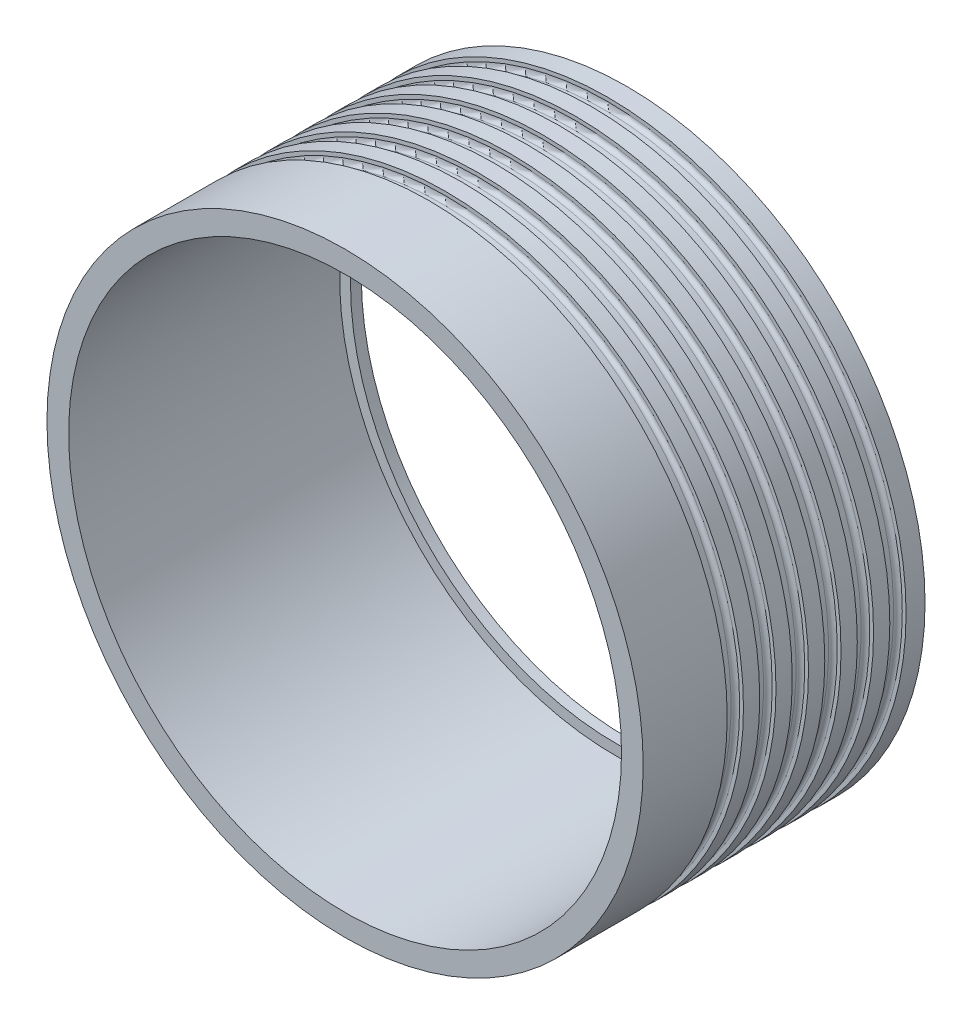
ISO-10303-21;
HEADER;
FILE_DESCRIPTION(('STEP AP214'),'2;1');
FILE_NAME('part.step','',(''),(''),'','','');
FILE_SCHEMA(('AUTOMOTIVE_DESIGN { 1 0 10303 214 1 1 1 1 }'));
ENDSEC;
DATA;
#1=APPLICATION_CONTEXT('core data for automotive mechanical design processes');
#2=APPLICATION_PROTOCOL_DEFINITION('international standard','automotive_design',2000,#1);
#3=PRODUCT_CONTEXT('',#1,'mechanical');
#4=PRODUCT('Part','Part','',(#3));
#5=PRODUCT_RELATED_PRODUCT_CATEGORY('part','',(#4));
#6=PRODUCT_DEFINITION_FORMATION('','',#4);
#7=PRODUCT_DEFINITION_CONTEXT('part definition',#1,'design');
#8=PRODUCT_DEFINITION('design','',#6,#7);
#9=PRODUCT_DEFINITION_SHAPE('','',#8);
#10=(LENGTH_UNIT() NAMED_UNIT(*) SI_UNIT(.MILLI.,.METRE.));
#11=(NAMED_UNIT(*) PLANE_ANGLE_UNIT() SI_UNIT($,.RADIAN.));
#12=(NAMED_UNIT(*) SI_UNIT($,.STERADIAN.) SOLID_ANGLE_UNIT());
#13=UNCERTAINTY_MEASURE_WITH_UNIT(LENGTH_MEASURE(1.E-05),#10,'distance_accuracy_value','');
#14=(GEOMETRIC_REPRESENTATION_CONTEXT(3) GLOBAL_UNCERTAINTY_ASSIGNED_CONTEXT((#13)) GLOBAL_UNIT_ASSIGNED_CONTEXT((#10,
#11,#12)) REPRESENTATION_CONTEXT('',''));
#15=CARTESIAN_POINT('',(0.,0.,0.));
#16=DIRECTION('',(0.,0.,1.));
#17=DIRECTION('',(1.,0.,0.));
#18=AXIS2_PLACEMENT_3D('',#15,#16,#17);
#19=CARTESIAN_POINT('',(0.,28.0540529829093,9.25000000000001));
#20=DIRECTION('',(0.,0.,1.));
#21=DIRECTION('',(1.,0.,0.));
#22=AXIS2_PLACEMENT_3D('',#19,#20,#21);
#23=PLANE('',#22);
#24=CARTESIAN_POINT('',(0.,0.,9.25000000000001));
#25=DIRECTION('',(0.,0.,-1.));
#26=DIRECTION('',(-1.,0.,0.));
#27=AXIS2_PLACEMENT_3D('',#24,#25,#26);
#28=CIRCLE('',#27,27.5);
#29=CARTESIAN_POINT('',(-27.5,0.,9.25000000000001));
#30=VERTEX_POINT('',#29);
#31=EDGE_CURVE('E113',#30,#30,#28,.F.);
#32=ORIENTED_EDGE('',*,*,#31,.F.);
#33=EDGE_LOOP('',(#32));
#34=FACE_BOUND('',#33,.T.);
#35=CARTESIAN_POINT('',(0.,0.,9.25000000000001));
#36=DIRECTION('',(0.,0.,-1.));
#37=DIRECTION('',(1.,0.,0.));
#38=AXIS2_PLACEMENT_3D('',#35,#36,#37);
#39=CIRCLE('',#38,27.15);
#40=CARTESIAN_POINT('',(-27.15,0.,9.25000000000001));
#41=VERTEX_POINT('',#40);
#42=CARTESIAN_POINT('',(27.15,0.,9.25000000000001));
#43=VERTEX_POINT('',#42);
#44=EDGE_CURVE('E109',#41,#43,#39,.F.);
#45=ORIENTED_EDGE('',*,*,#44,.T.);
#46=CARTESIAN_POINT('',(0.,0.,9.25000000000001));
#47=DIRECTION('',(0.,0.,-1.));
#48=DIRECTION('',(-1.,0.,0.));
#49=AXIS2_PLACEMENT_3D('',#46,#47,#48);
#50=CIRCLE('',#49,27.15);
#51=EDGE_CURVE('E106',#43,#41,#50,.F.);
#52=ORIENTED_EDGE('',*,*,#51,.T.);
#53=EDGE_LOOP('',(#45,#52));
#54=FACE_BOUND('',#53,.T.);
#55=ADVANCED_FACE('F17',(#34,#54),#23,.F.);
#56=CARTESIAN_POINT('',(0.,0.,26.));
#57=DIRECTION('',(0.,0.,-1.));
#58=DIRECTION('',(-1.,0.,0.));
#59=AXIS2_PLACEMENT_3D('',#56,#57,#58);
#60=CYLINDRICAL_SURFACE('',#59,27.5);
#61=ORIENTED_EDGE('',*,*,#31,.T.);
#62=EDGE_LOOP('',(#61));
#63=FACE_BOUND('',#62,.T.);
#64=CARTESIAN_POINT('',(0.,0.,10.75));
#65=DIRECTION('',(0.,0.,-1.));
#66=DIRECTION('',(-1.,0.,0.));
#67=AXIS2_PLACEMENT_3D('',#64,#65,#66);
#68=CIRCLE('',#67,27.5);
#69=CARTESIAN_POINT('',(-27.5,0.,10.75));
#70=VERTEX_POINT('',#69);
#71=EDGE_CURVE('E116',#70,#70,#68,.T.);
#72=ORIENTED_EDGE('',*,*,#71,.T.);
#73=EDGE_LOOP('',(#72));
#74=FACE_BOUND('',#73,.T.);
#75=ADVANCED_FACE('F142',(#63,#74),#60,.T.);
#76=CARTESIAN_POINT('',(0.,0.,8.85));
#77=DIRECTION('',(0.,0.,-1.));
#78=DIRECTION('',(-1.,0.,0.));
#79=AXIS2_PLACEMENT_3D('',#76,#77,#78);
#80=TOROIDAL_SURFACE('',#79,27.15,0.400000000000001);
#81=CARTESIAN_POINT('',(0.,0.,8.85));
#82=DIRECTION('',(0.,0.,-1.));
#83=DIRECTION('',(-1.,0.,0.));
#84=AXIS2_PLACEMENT_3D('',#81,#82,#83);
#85=CIRCLE('',#84,26.75);
#86=CARTESIAN_POINT('',(-26.75,0.,8.85));
#87=VERTEX_POINT('',#86);
#88=EDGE_CURVE('E149',#87,#87,#85,.T.);
#89=ORIENTED_EDGE('',*,*,#88,.F.);
#90=EDGE_LOOP('',(#89));
#91=FACE_BOUND('',#90,.T.);
#92=ORIENTED_EDGE('',*,*,#44,.F.);
#93=ORIENTED_EDGE('',*,*,#51,.F.);
#94=EDGE_LOOP('',(#92,#93));
#95=FACE_BOUND('',#94,.T.);
#96=ADVANCED_FACE('F110',(#91,#95),#80,.F.);
#97=CARTESIAN_POINT('',(0.,28.0540529829093,10.75));
#98=DIRECTION('',(0.,0.,-1.));
#99=DIRECTION('',(-1.,0.,0.));
#100=AXIS2_PLACEMENT_3D('',#97,#98,#99);
#101=PLANE('',#100);
#102=ORIENTED_EDGE('',*,*,#71,.F.);
#103=EDGE_LOOP('',(#102));
#104=FACE_BOUND('',#103,.T.);
#105=CARTESIAN_POINT('',(0.,0.,10.75));
#106=DIRECTION('',(0.,0.,1.));
#107=DIRECTION('',(-1.,0.,0.));
#108=AXIS2_PLACEMENT_3D('',#105,#106,#107);
#109=CIRCLE('',#108,27.15);
#110=CARTESIAN_POINT('',(27.15,0.,10.75));
#111=VERTEX_POINT('',#110);
#112=CARTESIAN_POINT('',(-27.15,0.,10.75));
#113=VERTEX_POINT('',#112);
#114=EDGE_CURVE('E152',#111,#113,#109,.F.);
#115=ORIENTED_EDGE('',*,*,#114,.T.);
#116=CARTESIAN_POINT('',(0.,0.,10.75));
#117=DIRECTION('',(0.,0.,1.));
#118=DIRECTION('',(1.,0.,0.));
#119=AXIS2_PLACEMENT_3D('',#116,#117,#118);
#120=CIRCLE('',#119,27.15);
#121=EDGE_CURVE('E184',#113,#111,#120,.F.);
#122=ORIENTED_EDGE('',*,*,#121,.T.);
#123=EDGE_LOOP('',(#115,#122));
#124=FACE_BOUND('',#123,.T.);
#125=ADVANCED_FACE('F141',(#104,#124),#101,.F.);
#126=CARTESIAN_POINT('',(0.,0.,4.7));
#127=DIRECTION('',(0.,0.,-1.));
#128=DIRECTION('',(-1.,0.,0.));
#129=AXIS2_PLACEMENT_3D('',#126,#127,#128);
#130=CYLINDRICAL_SURFACE('',#129,26.75);
#131=CARTESIAN_POINT('',(0.,0.,8.15000000000001));
#132=DIRECTION('',(0.,0.,-1.));
#133=DIRECTION('',(-1.,0.,0.));
#134=AXIS2_PLACEMENT_3D('',#131,#132,#133);
#135=CIRCLE('',#134,26.75);
#136=CARTESIAN_POINT('',(-26.75,0.,8.15000000000001));
#137=VERTEX_POINT('',#136);
#138=EDGE_CURVE('E181',#137,#137,#135,.F.);
#139=ORIENTED_EDGE('',*,*,#138,.T.);
#140=EDGE_LOOP('',(#139));
#141=FACE_BOUND('',#140,.T.);
#142=ORIENTED_EDGE('',*,*,#88,.T.);
#143=EDGE_LOOP('',(#142));
#144=FACE_BOUND('',#143,.T.);
#145=ADVANCED_FACE('F170',(#141,#144),#130,.T.);
#146=CARTESIAN_POINT('',(0.,0.,11.15));
#147=DIRECTION('',(0.,0.,-1.));
#148=DIRECTION('',(-1.,0.,0.));
#149=AXIS2_PLACEMENT_3D('',#146,#147,#148);
#150=TOROIDAL_SURFACE('',#149,27.15,0.4);
#151=ORIENTED_EDGE('',*,*,#121,.F.);
#152=ORIENTED_EDGE('',*,*,#114,.F.);
#153=EDGE_LOOP('',(#151,#152));
#154=FACE_BOUND('',#153,.T.);
#155=CARTESIAN_POINT('',(0.,0.,11.15));
#156=DIRECTION('',(0.,0.,-1.));
#157=DIRECTION('',(-1.,0.,0.));
#158=AXIS2_PLACEMENT_3D('',#155,#156,#157);
#159=CIRCLE('',#158,26.75);
#160=CARTESIAN_POINT('',(-26.75,0.,11.15));
#161=VERTEX_POINT('',#160);
#162=EDGE_CURVE('E179',#161,#161,#159,.F.);
#163=ORIENTED_EDGE('',*,*,#162,.F.);
#164=EDGE_LOOP('',(#163));
#165=FACE_BOUND('',#164,.T.);
#166=ADVANCED_FACE('F159',(#154,#165),#150,.F.);
#167=CARTESIAN_POINT('',(0.,0.,8.15));
#168=DIRECTION('',(0.,0.,-1.));
#169=DIRECTION('',(-1.,0.,0.));
#170=AXIS2_PLACEMENT_3D('',#167,#168,#169);
#171=TOROIDAL_SURFACE('',#170,27.15,0.4);
#172=CARTESIAN_POINT('',(0.,0.,7.75));
#173=DIRECTION('',(0.,0.,1.));
#174=DIRECTION('',(1.,0.,0.));
#175=AXIS2_PLACEMENT_3D('',#172,#173,#174);
#176=CIRCLE('',#175,27.15);
#177=CARTESIAN_POINT('',(27.15,0.,7.75));
#178=VERTEX_POINT('',#177);
#179=CARTESIAN_POINT('',(-27.15,0.,7.75));
#180=VERTEX_POINT('',#179);
#181=EDGE_CURVE('E278',#178,#180,#176,.T.);
#182=ORIENTED_EDGE('',*,*,#181,.T.);
#183=CARTESIAN_POINT('',(0.,0.,7.75));
#184=DIRECTION('',(0.,0.,1.));
#185=DIRECTION('',(-1.,0.,0.));
#186=AXIS2_PLACEMENT_3D('',#183,#184,#185);
#187=CIRCLE('',#186,27.15);
#188=EDGE_CURVE('E225',#180,#178,#187,.T.);
#189=ORIENTED_EDGE('',*,*,#188,.T.);
#190=EDGE_LOOP('',(#182,#189));
#191=FACE_BOUND('',#190,.T.);
#192=ORIENTED_EDGE('',*,*,#138,.F.);
#193=EDGE_LOOP('',(#192));
#194=FACE_BOUND('',#193,.T.);
#195=ADVANCED_FACE('F169',(#191,#194),#171,.F.);
#196=CARTESIAN_POINT('',(0.,0.,7.7));
#197=DIRECTION('',(0.,0.,-1.));
#198=DIRECTION('',(-1.,0.,0.));
#199=AXIS2_PLACEMENT_3D('',#196,#197,#198);
#200=CYLINDRICAL_SURFACE('',#199,26.75);
#201=ORIENTED_EDGE('',*,*,#162,.T.);
#202=EDGE_LOOP('',(#201));
#203=FACE_BOUND('',#202,.T.);
#204=CARTESIAN_POINT('',(0.,0.,11.85));
#205=DIRECTION('',(0.,0.,-1.));
#206=DIRECTION('',(-1.,0.,0.));
#207=AXIS2_PLACEMENT_3D('',#204,#205,#206);
#208=CIRCLE('',#207,26.75);
#209=CARTESIAN_POINT('',(-26.75,0.,11.85));
#210=VERTEX_POINT('',#209);
#211=EDGE_CURVE('E282',#210,#210,#208,.T.);
#212=ORIENTED_EDGE('',*,*,#211,.T.);
#213=EDGE_LOOP('',(#212));
#214=FACE_BOUND('',#213,.T.);
#215=ADVANCED_FACE('F303',(#203,#214),#200,.T.);
#216=CARTESIAN_POINT('',(0.,28.0540529829093,7.75));
#217=DIRECTION('',(0.,0.,-1.));
#218=DIRECTION('',(-1.,0.,0.));
#219=AXIS2_PLACEMENT_3D('',#216,#217,#218);
#220=PLANE('',#219);
#221=CARTESIAN_POINT('',(0.,0.,7.75));
#222=DIRECTION('',(0.,0.,-1.));
#223=DIRECTION('',(-1.,0.,0.));
#224=AXIS2_PLACEMENT_3D('',#221,#222,#223);
#225=CIRCLE('',#224,27.5);
#226=CARTESIAN_POINT('',(-27.5,0.,7.75));
#227=VERTEX_POINT('',#226);
#228=EDGE_CURVE('E289',#227,#227,#225,.T.);
#229=ORIENTED_EDGE('',*,*,#228,.F.);
#230=EDGE_LOOP('',(#229));
#231=FACE_BOUND('',#230,.T.);
#232=ORIENTED_EDGE('',*,*,#188,.F.);
#233=ORIENTED_EDGE('',*,*,#181,.F.);
#234=EDGE_LOOP('',(#232,#233));
#235=FACE_BOUND('',#234,.T.);
#236=ADVANCED_FACE('F244',(#231,#235),#220,.F.);
#237=CARTESIAN_POINT('',(0.,0.,11.85));
#238=DIRECTION('',(0.,0.,-1.));
#239=DIRECTION('',(-1.,0.,0.));
#240=AXIS2_PLACEMENT_3D('',#237,#238,#239);
#241=TOROIDAL_SURFACE('',#240,27.15,0.400000000000001);
#242=ORIENTED_EDGE('',*,*,#211,.F.);
#243=EDGE_LOOP('',(#242));
#244=FACE_BOUND('',#243,.T.);
#245=CARTESIAN_POINT('',(0.,0.,12.25));
#246=DIRECTION('',(0.,0.,-1.));
#247=DIRECTION('',(1.,0.,0.));
#248=AXIS2_PLACEMENT_3D('',#245,#246,#247);
#249=CIRCLE('',#248,27.15);
#250=CARTESIAN_POINT('',(27.15,0.,12.25));
#251=VERTEX_POINT('',#250);
#252=CARTESIAN_POINT('',(-27.15,0.,12.25));
#253=VERTEX_POINT('',#252);
#254=EDGE_CURVE('E307',#251,#253,#249,.T.);
#255=ORIENTED_EDGE('',*,*,#254,.T.);
#256=CARTESIAN_POINT('',(0.,0.,12.25));
#257=DIRECTION('',(0.,0.,-1.));
#258=DIRECTION('',(-1.,0.,0.));
#259=AXIS2_PLACEMENT_3D('',#256,#257,#258);
#260=CIRCLE('',#259,27.15);
#261=EDGE_CURVE('E258',#253,#251,#260,.T.);
#262=ORIENTED_EDGE('',*,*,#261,.T.);
#263=EDGE_LOOP('',(#255,#262));
#264=FACE_BOUND('',#263,.T.);
#265=ADVANCED_FACE('F232',(#244,#264),#241,.F.);
#266=CARTESIAN_POINT('',(0.,0.,26.));
#267=DIRECTION('',(0.,0.,-1.));
#268=DIRECTION('',(-1.,0.,0.));
#269=AXIS2_PLACEMENT_3D('',#266,#267,#268);
#270=CYLINDRICAL_SURFACE('',#269,27.5);
#271=ORIENTED_EDGE('',*,*,#228,.T.);
#272=EDGE_LOOP('',(#271));
#273=FACE_BOUND('',#272,.T.);
#274=CARTESIAN_POINT('',(0.,0.,6.25));
#275=DIRECTION('',(0.,0.,-1.));
#276=DIRECTION('',(-1.,0.,0.));
#277=AXIS2_PLACEMENT_3D('',#274,#275,#276);
#278=CIRCLE('',#277,27.5);
#279=CARTESIAN_POINT('',(-27.5,0.,6.25));
#280=VERTEX_POINT('',#279);
#281=EDGE_CURVE('E310',#280,#280,#278,.F.);
#282=ORIENTED_EDGE('',*,*,#281,.T.);
#283=EDGE_LOOP('',(#282));
#284=FACE_BOUND('',#283,.T.);
#285=ADVANCED_FACE('F243',(#273,#284),#270,.T.);
#286=CARTESIAN_POINT('',(0.,28.0540529829093,12.25));
#287=DIRECTION('',(0.,0.,1.));
#288=DIRECTION('',(1.,0.,0.));
#289=AXIS2_PLACEMENT_3D('',#286,#287,#288);
#290=PLANE('',#289);
#291=CARTESIAN_POINT('',(0.,0.,12.25));
#292=DIRECTION('',(0.,0.,-1.));
#293=DIRECTION('',(-1.,0.,0.));
#294=AXIS2_PLACEMENT_3D('',#291,#292,#293);
#295=CIRCLE('',#294,27.5);
#296=CARTESIAN_POINT('',(-27.5,0.,12.25));
#297=VERTEX_POINT('',#296);
#298=EDGE_CURVE('E763',#297,#297,#295,.F.);
#299=ORIENTED_EDGE('',*,*,#298,.F.);
#300=EDGE_LOOP('',(#299));
#301=FACE_BOUND('',#300,.T.);
#302=ORIENTED_EDGE('',*,*,#254,.F.);
#303=ORIENTED_EDGE('',*,*,#261,.F.);
#304=EDGE_LOOP('',(#302,#303));
#305=FACE_BOUND('',#304,.T.);
#306=ADVANCED_FACE('F663',(#301,#305),#290,.F.);
#307=CARTESIAN_POINT('',(0.,28.0540529829093,6.25));
#308=DIRECTION('',(0.,0.,1.));
#309=DIRECTION('',(1.,0.,0.));
#310=AXIS2_PLACEMENT_3D('',#307,#308,#309);
#311=PLANE('',#310);
#312=ORIENTED_EDGE('',*,*,#281,.F.);
#313=EDGE_LOOP('',(#312));
#314=FACE_BOUND('',#313,.T.);
#315=CARTESIAN_POINT('',(0.,0.,6.25));
#316=DIRECTION('',(0.,0.,-1.));
#317=DIRECTION('',(1.,0.,0.));
#318=AXIS2_PLACEMENT_3D('',#315,#316,#317);
#319=CIRCLE('',#318,27.15);
#320=CARTESIAN_POINT('',(-27.15,0.,6.25));
#321=VERTEX_POINT('',#320);
#322=CARTESIAN_POINT('',(27.15,0.,6.25));
#323=VERTEX_POINT('',#322);
#324=EDGE_CURVE('E648',#321,#323,#319,.F.);
#325=ORIENTED_EDGE('',*,*,#324,.T.);
#326=CARTESIAN_POINT('',(0.,0.,6.25));
#327=DIRECTION('',(0.,0.,-1.));
#328=DIRECTION('',(-1.,0.,0.));
#329=AXIS2_PLACEMENT_3D('',#326,#327,#328);
#330=CIRCLE('',#329,27.15);
#331=EDGE_CURVE('E677',#323,#321,#330,.F.);
#332=ORIENTED_EDGE('',*,*,#331,.T.);
#333=EDGE_LOOP('',(#325,#332));
#334=FACE_BOUND('',#333,.T.);
#335=ADVANCED_FACE('F654',(#314,#334),#311,.F.);
#336=CARTESIAN_POINT('',(0.,0.,26.));
#337=DIRECTION('',(0.,0.,-1.));
#338=DIRECTION('',(-1.,0.,0.));
#339=AXIS2_PLACEMENT_3D('',#336,#337,#338);
#340=CYLINDRICAL_SURFACE('',#339,27.5);
#341=ORIENTED_EDGE('',*,*,#298,.T.);
#342=EDGE_LOOP('',(#341));
#343=FACE_BOUND('',#342,.T.);
#344=CARTESIAN_POINT('',(0.,0.,13.75));
#345=DIRECTION('',(0.,0.,-1.));
#346=DIRECTION('',(-1.,0.,0.));
#347=AXIS2_PLACEMENT_3D('',#344,#345,#346);
#348=CIRCLE('',#347,27.5);
#349=CARTESIAN_POINT('',(-27.5,0.,13.75));
#350=VERTEX_POINT('',#349);
#351=EDGE_CURVE('E641',#350,#350,#348,.T.);
#352=ORIENTED_EDGE('',*,*,#351,.T.);
#353=EDGE_LOOP('',(#352));
#354=FACE_BOUND('',#353,.T.);
#355=ADVANCED_FACE('F662',(#343,#354),#340,.T.);
#356=CARTESIAN_POINT('',(0.,0.,5.85));
#357=DIRECTION('',(0.,0.,-1.));
#358=DIRECTION('',(-1.,0.,0.));
#359=AXIS2_PLACEMENT_3D('',#356,#357,#358);
#360=TOROIDAL_SURFACE('',#359,27.15,0.400000000000001);
#361=CARTESIAN_POINT('',(0.,0.,5.85));
#362=DIRECTION('',(0.,0.,-1.));
#363=DIRECTION('',(-1.,0.,0.));
#364=AXIS2_PLACEMENT_3D('',#361,#362,#363);
#365=CIRCLE('',#364,26.75);
#366=CARTESIAN_POINT('',(-26.75,0.,5.85));
#367=VERTEX_POINT('',#366);
#368=EDGE_CURVE('E634',#367,#367,#365,.T.);
#369=ORIENTED_EDGE('',*,*,#368,.F.);
#370=EDGE_LOOP('',(#369));
#371=FACE_BOUND('',#370,.T.);
#372=ORIENTED_EDGE('',*,*,#324,.F.);
#373=ORIENTED_EDGE('',*,*,#331,.F.);
#374=EDGE_LOOP('',(#372,#373));
#375=FACE_BOUND('',#374,.T.);
#376=ADVANCED_FACE('F615',(#371,#375),#360,.F.);
#377=CARTESIAN_POINT('',(0.,28.0540529829093,13.75));
#378=DIRECTION('',(0.,0.,-1.));
#379=DIRECTION('',(-1.,0.,0.));
#380=AXIS2_PLACEMENT_3D('',#377,#378,#379);
#381=PLANE('',#380);
#382=ORIENTED_EDGE('',*,*,#351,.F.);
#383=EDGE_LOOP('',(#382));
#384=FACE_BOUND('',#383,.T.);
#385=CARTESIAN_POINT('',(0.,0.,13.75));
#386=DIRECTION('',(0.,0.,1.));
#387=DIRECTION('',(-1.,0.,0.));
#388=AXIS2_PLACEMENT_3D('',#385,#386,#387);
#389=CIRCLE('',#388,27.15);
#390=CARTESIAN_POINT('',(27.15,0.,13.75));
#391=VERTEX_POINT('',#390);
#392=CARTESIAN_POINT('',(-27.15,0.,13.75));
#393=VERTEX_POINT('',#392);
#394=EDGE_CURVE('E598',#391,#393,#389,.F.);
#395=ORIENTED_EDGE('',*,*,#394,.T.);
#396=CARTESIAN_POINT('',(0.,0.,13.75));
#397=DIRECTION('',(0.,0.,1.));
#398=DIRECTION('',(1.,0.,0.));
#399=AXIS2_PLACEMENT_3D('',#396,#397,#398);
#400=CIRCLE('',#399,27.15);
#401=EDGE_CURVE('E594',#393,#391,#400,.F.);
#402=ORIENTED_EDGE('',*,*,#401,.T.);
#403=EDGE_LOOP('',(#395,#402));
#404=FACE_BOUND('',#403,.T.);
#405=ADVANCED_FACE('F605',(#384,#404),#381,.F.);
#406=CARTESIAN_POINT('',(0.,0.,1.7));
#407=DIRECTION('',(0.,0.,-1.));
#408=DIRECTION('',(-1.,0.,0.));
#409=AXIS2_PLACEMENT_3D('',#406,#407,#408);
#410=CYLINDRICAL_SURFACE('',#409,26.75);
#411=CARTESIAN_POINT('',(0.,0.,5.15000000000001));
#412=DIRECTION('',(0.,0.,-1.));
#413=DIRECTION('',(-1.,0.,0.));
#414=AXIS2_PLACEMENT_3D('',#411,#412,#413);
#415=CIRCLE('',#414,26.75);
#416=CARTESIAN_POINT('',(-26.75,0.,5.15000000000001));
#417=VERTEX_POINT('',#416);
#418=EDGE_CURVE('E589',#417,#417,#415,.F.);
#419=ORIENTED_EDGE('',*,*,#418,.T.);
#420=EDGE_LOOP('',(#419));
#421=FACE_BOUND('',#420,.T.);
#422=ORIENTED_EDGE('',*,*,#368,.T.);
#423=EDGE_LOOP('',(#422));
#424=FACE_BOUND('',#423,.T.);
#425=ADVANCED_FACE('F614',(#421,#424),#410,.T.);
#426=CARTESIAN_POINT('',(0.,0.,14.15));
#427=DIRECTION('',(0.,0.,-1.));
#428=DIRECTION('',(-1.,0.,0.));
#429=AXIS2_PLACEMENT_3D('',#426,#427,#428);
#430=TOROIDAL_SURFACE('',#429,27.15,0.4);
#431=ORIENTED_EDGE('',*,*,#401,.F.);
#432=ORIENTED_EDGE('',*,*,#394,.F.);
#433=EDGE_LOOP('',(#431,#432));
#434=FACE_BOUND('',#433,.T.);
#435=CARTESIAN_POINT('',(0.,0.,14.15));
#436=DIRECTION('',(0.,0.,-1.));
#437=DIRECTION('',(-1.,0.,0.));
#438=AXIS2_PLACEMENT_3D('',#435,#436,#437);
#439=CIRCLE('',#438,26.75);
#440=CARTESIAN_POINT('',(-26.75,0.,14.15));
#441=VERTEX_POINT('',#440);
#442=EDGE_CURVE('E582',#441,#441,#439,.F.);
#443=ORIENTED_EDGE('',*,*,#442,.F.);
#444=EDGE_LOOP('',(#443));
#445=FACE_BOUND('',#444,.T.);
#446=ADVANCED_FACE('F567',(#434,#445),#430,.F.);
#447=CARTESIAN_POINT('',(0.,0.,5.15));
#448=DIRECTION('',(0.,0.,-1.));
#449=DIRECTION('',(-1.,0.,0.));
#450=AXIS2_PLACEMENT_3D('',#447,#448,#449);
#451=TOROIDAL_SURFACE('',#450,27.15,0.4);
#452=CARTESIAN_POINT('',(0.,0.,4.75));
#453=DIRECTION('',(0.,0.,1.));
#454=DIRECTION('',(1.,0.,0.));
#455=AXIS2_PLACEMENT_3D('',#452,#453,#454);
#456=CIRCLE('',#455,27.15);
#457=CARTESIAN_POINT('',(27.15,0.,4.75));
#458=VERTEX_POINT('',#457);
#459=CARTESIAN_POINT('',(-27.15,0.,4.75));
#460=VERTEX_POINT('',#459);
#461=EDGE_CURVE('E578',#458,#460,#456,.T.);
#462=ORIENTED_EDGE('',*,*,#461,.T.);
#463=CARTESIAN_POINT('',(0.,0.,4.75));
#464=DIRECTION('',(0.,0.,1.));
#465=DIRECTION('',(-1.,0.,0.));
#466=AXIS2_PLACEMENT_3D('',#463,#464,#465);
#467=CIRCLE('',#466,27.15);
#468=EDGE_CURVE('E550',#460,#458,#467,.T.);
#469=ORIENTED_EDGE('',*,*,#468,.T.);
#470=EDGE_LOOP('',(#462,#469));
#471=FACE_BOUND('',#470,.T.);
#472=ORIENTED_EDGE('',*,*,#418,.F.);
#473=EDGE_LOOP('',(#472));
#474=FACE_BOUND('',#473,.T.);
#475=ADVANCED_FACE('F556',(#471,#474),#451,.F.);
#476=CARTESIAN_POINT('',(0.,0.,10.7));
#477=DIRECTION('',(0.,0.,-1.));
#478=DIRECTION('',(-1.,0.,0.));
#479=AXIS2_PLACEMENT_3D('',#476,#477,#478);
#480=CYLINDRICAL_SURFACE('',#479,26.75);
#481=ORIENTED_EDGE('',*,*,#442,.T.);
#482=EDGE_LOOP('',(#481));
#483=FACE_BOUND('',#482,.T.);
#484=CARTESIAN_POINT('',(0.,0.,14.85));
#485=DIRECTION('',(0.,0.,-1.));
#486=DIRECTION('',(-1.,0.,0.));
#487=AXIS2_PLACEMENT_3D('',#484,#485,#486);
#488=CIRCLE('',#487,26.75);
#489=CARTESIAN_POINT('',(-26.75,0.,14.85));
#490=VERTEX_POINT('',#489);
#491=EDGE_CURVE('E576',#490,#490,#488,.T.);
#492=ORIENTED_EDGE('',*,*,#491,.T.);
#493=EDGE_LOOP('',(#492));
#494=FACE_BOUND('',#493,.T.);
#495=ADVANCED_FACE('F566',(#483,#494),#480,.T.);
#496=CARTESIAN_POINT('',(0.,28.0540529829093,4.75));
#497=DIRECTION('',(0.,0.,-1.));
#498=DIRECTION('',(-1.,0.,0.));
#499=AXIS2_PLACEMENT_3D('',#496,#497,#498);
#500=PLANE('',#499);
#501=CARTESIAN_POINT('',(0.,0.,4.75));
#502=DIRECTION('',(0.,0.,-1.));
#503=DIRECTION('',(-1.,0.,0.));
#504=AXIS2_PLACEMENT_3D('',#501,#502,#503);
#505=CIRCLE('',#504,27.5);
#506=CARTESIAN_POINT('',(-27.5,0.,4.75));
#507=VERTEX_POINT('',#506);
#508=EDGE_CURVE('E759',#507,#507,#505,.T.);
#509=ORIENTED_EDGE('',*,*,#508,.F.);
#510=EDGE_LOOP('',(#509));
#511=FACE_BOUND('',#510,.T.);
#512=ORIENTED_EDGE('',*,*,#468,.F.);
#513=ORIENTED_EDGE('',*,*,#461,.F.);
#514=EDGE_LOOP('',(#512,#513));
#515=FACE_BOUND('',#514,.T.);
#516=ADVANCED_FACE('F530',(#511,#515),#500,.F.);
#517=CARTESIAN_POINT('',(0.,0.,14.85));
#518=DIRECTION('',(0.,0.,-1.));
#519=DIRECTION('',(-1.,0.,0.));
#520=AXIS2_PLACEMENT_3D('',#517,#518,#519);
#521=TOROIDAL_SURFACE('',#520,27.15,0.400000000000001);
#522=ORIENTED_EDGE('',*,*,#491,.F.);
#523=EDGE_LOOP('',(#522));
#524=FACE_BOUND('',#523,.T.);
#525=CARTESIAN_POINT('',(0.,0.,15.25));
#526=DIRECTION('',(0.,0.,-1.));
#527=DIRECTION('',(1.,0.,0.));
#528=AXIS2_PLACEMENT_3D('',#525,#526,#527);
#529=CIRCLE('',#528,27.15);
#530=CARTESIAN_POINT('',(27.15,0.,15.25));
#531=VERTEX_POINT('',#530);
#532=CARTESIAN_POINT('',(-27.15,0.,15.25));
#533=VERTEX_POINT('',#532);
#534=EDGE_CURVE('E501',#531,#533,#529,.T.);
#535=ORIENTED_EDGE('',*,*,#534,.T.);
#536=CARTESIAN_POINT('',(0.,0.,15.25));
#537=DIRECTION('',(0.,0.,-1.));
#538=DIRECTION('',(-1.,0.,0.));
#539=AXIS2_PLACEMENT_3D('',#536,#537,#538);
#540=CIRCLE('',#539,27.15);
#541=EDGE_CURVE('E512',#533,#531,#540,.T.);
#542=ORIENTED_EDGE('',*,*,#541,.T.);
#543=EDGE_LOOP('',(#535,#542));
#544=FACE_BOUND('',#543,.T.);
#545=ADVANCED_FACE('F525',(#524,#544),#521,.F.);
#546=CARTESIAN_POINT('',(0.,0.,26.));
#547=DIRECTION('',(0.,0.,-1.));
#548=DIRECTION('',(-1.,0.,0.));
#549=AXIS2_PLACEMENT_3D('',#546,#547,#548);
#550=CYLINDRICAL_SURFACE('',#549,27.5);
#551=ORIENTED_EDGE('',*,*,#508,.T.);
#552=EDGE_LOOP('',(#551));
#553=FACE_BOUND('',#552,.T.);
#554=CARTESIAN_POINT('',(0.,0.,3.25));
#555=DIRECTION('',(0.,0.,-1.));
#556=DIRECTION('',(-1.,0.,0.));
#557=AXIS2_PLACEMENT_3D('',#554,#555,#556);
#558=CIRCLE('',#557,27.5);
#559=CARTESIAN_POINT('',(-27.5,0.,3.25));
#560=VERTEX_POINT('',#559);
#561=EDGE_CURVE('E756',#560,#560,#558,.F.);
#562=ORIENTED_EDGE('',*,*,#561,.T.);
#563=EDGE_LOOP('',(#562));
#564=FACE_BOUND('',#563,.T.);
#565=ADVANCED_FACE('F529',(#553,#564),#550,.T.);
#566=CARTESIAN_POINT('',(0.,28.0540529829093,15.25));
#567=DIRECTION('',(0.,0.,1.));
#568=DIRECTION('',(1.,0.,0.));
#569=AXIS2_PLACEMENT_3D('',#566,#567,#568);
#570=PLANE('',#569);
#571=CARTESIAN_POINT('',(0.,0.,15.25));
#572=DIRECTION('',(0.,0.,-1.));
#573=DIRECTION('',(-1.,0.,0.));
#574=AXIS2_PLACEMENT_3D('',#571,#572,#573);
#575=CIRCLE('',#574,27.5);
#576=CARTESIAN_POINT('',(-27.5,0.,15.25));
#577=VERTEX_POINT('',#576);
#578=EDGE_CURVE('E753',#577,#577,#575,.F.);
#579=ORIENTED_EDGE('',*,*,#578,.F.);
#580=EDGE_LOOP('',(#579));
#581=FACE_BOUND('',#580,.T.);
#582=ORIENTED_EDGE('',*,*,#534,.F.);
#583=ORIENTED_EDGE('',*,*,#541,.F.);
#584=EDGE_LOOP('',(#582,#583));
#585=FACE_BOUND('',#584,.T.);
#586=ADVANCED_FACE('F477',(#581,#585),#570,.F.);
#587=CARTESIAN_POINT('',(0.,28.0540529829093,3.25));
#588=DIRECTION('',(0.,0.,1.));
#589=DIRECTION('',(1.,0.,0.));
#590=AXIS2_PLACEMENT_3D('',#587,#588,#589);
#591=PLANE('',#590);
#592=ORIENTED_EDGE('',*,*,#561,.F.);
#593=EDGE_LOOP('',(#592));
#594=FACE_BOUND('',#593,.T.);
#595=CARTESIAN_POINT('',(0.,0.,3.25));
#596=DIRECTION('',(0.,0.,-1.));
#597=DIRECTION('',(1.,0.,0.));
#598=AXIS2_PLACEMENT_3D('',#595,#596,#597);
#599=CIRCLE('',#598,27.15);
#600=CARTESIAN_POINT('',(-27.15,0.,3.25));
#601=VERTEX_POINT('',#600);
#602=CARTESIAN_POINT('',(27.15,0.,3.25));
#603=VERTEX_POINT('',#602);
#604=EDGE_CURVE('E431',#601,#603,#599,.F.);
#605=ORIENTED_EDGE('',*,*,#604,.T.);
#606=CARTESIAN_POINT('',(0.,0.,3.25));
#607=DIRECTION('',(0.,0.,-1.));
#608=DIRECTION('',(-1.,0.,0.));
#609=AXIS2_PLACEMENT_3D('',#606,#607,#608);
#610=CIRCLE('',#609,27.15);
#611=EDGE_CURVE('E490',#603,#601,#610,.F.);
#612=ORIENTED_EDGE('',*,*,#611,.T.);
#613=EDGE_LOOP('',(#605,#612));
#614=FACE_BOUND('',#613,.T.);
#615=ADVANCED_FACE('F468',(#594,#614),#591,.F.);
#616=CARTESIAN_POINT('',(0.,0.,26.));
#617=DIRECTION('',(0.,0.,-1.));
#618=DIRECTION('',(-1.,0.,0.));
#619=AXIS2_PLACEMENT_3D('',#616,#617,#618);
#620=CYLINDRICAL_SURFACE('',#619,27.5);
#621=ORIENTED_EDGE('',*,*,#578,.T.);
#622=EDGE_LOOP('',(#621));
#623=FACE_BOUND('',#622,.T.);
#624=CARTESIAN_POINT('',(0.,0.,16.75));
#625=DIRECTION('',(0.,0.,-1.));
#626=DIRECTION('',(-1.,0.,0.));
#627=AXIS2_PLACEMENT_3D('',#624,#625,#626);
#628=CIRCLE('',#627,27.5);
#629=CARTESIAN_POINT('',(-27.5,0.,16.75));
#630=VERTEX_POINT('',#629);
#631=EDGE_CURVE('E750',#630,#630,#628,.T.);
#632=ORIENTED_EDGE('',*,*,#631,.T.);
#633=EDGE_LOOP('',(#632));
#634=FACE_BOUND('',#633,.T.);
#635=ADVANCED_FACE('F451',(#623,#634),#620,.T.);
#636=CARTESIAN_POINT('',(0.,0.,2.85));
#637=DIRECTION('',(0.,0.,-1.));
#638=DIRECTION('',(-1.,0.,0.));
#639=AXIS2_PLACEMENT_3D('',#636,#637,#638);
#640=TOROIDAL_SURFACE('',#639,27.15,0.400000000000001);
#641=CARTESIAN_POINT('',(0.,0.,2.85));
#642=DIRECTION('',(0.,0.,-1.));
#643=DIRECTION('',(-1.,0.,0.));
#644=AXIS2_PLACEMENT_3D('',#641,#642,#643);
#645=CIRCLE('',#644,26.75);
#646=CARTESIAN_POINT('',(-26.75,0.,2.85));
#647=VERTEX_POINT('',#646);
#648=EDGE_CURVE('E460',#647,#647,#645,.T.);
#649=ORIENTED_EDGE('',*,*,#648,.F.);
#650=EDGE_LOOP('',(#649));
#651=FACE_BOUND('',#650,.T.);
#652=ORIENTED_EDGE('',*,*,#604,.F.);
#653=ORIENTED_EDGE('',*,*,#611,.F.);
#654=EDGE_LOOP('',(#652,#653));
#655=FACE_BOUND('',#654,.T.);
#656=ADVANCED_FACE('F439',(#651,#655),#640,.F.);
#657=CARTESIAN_POINT('',(0.,28.0540529829093,16.75));
#658=DIRECTION('',(0.,0.,-1.));
#659=DIRECTION('',(-1.,0.,0.));
#660=AXIS2_PLACEMENT_3D('',#657,#658,#659);
#661=PLANE('',#660);
#662=ORIENTED_EDGE('',*,*,#631,.F.);
#663=EDGE_LOOP('',(#662));
#664=FACE_BOUND('',#663,.T.);
#665=CARTESIAN_POINT('',(0.,0.,16.75));
#666=DIRECTION('',(0.,0.,1.));
#667=DIRECTION('',(-1.,0.,0.));
#668=AXIS2_PLACEMENT_3D('',#665,#666,#667);
#669=CIRCLE('',#668,27.15);
#670=CARTESIAN_POINT('',(27.15,0.,16.75));
#671=VERTEX_POINT('',#670);
#672=CARTESIAN_POINT('',(-27.15,0.,16.75));
#673=VERTEX_POINT('',#672);
#674=EDGE_CURVE('E418',#671,#673,#669,.F.);
#675=ORIENTED_EDGE('',*,*,#674,.T.);
#676=CARTESIAN_POINT('',(0.,0.,16.75));
#677=DIRECTION('',(0.,0.,1.));
#678=DIRECTION('',(1.,0.,0.));
#679=AXIS2_PLACEMENT_3D('',#676,#677,#678);
#680=CIRCLE('',#679,27.15);
#681=EDGE_CURVE('E856',#673,#671,#680,.F.);
#682=ORIENTED_EDGE('',*,*,#681,.T.);
#683=EDGE_LOOP('',(#675,#682));
#684=FACE_BOUND('',#683,.T.);
#685=ADVANCED_FACE('F450',(#664,#684),#661,.F.);
#686=CARTESIAN_POINT('',(0.,0.,-1.3));
#687=DIRECTION('',(0.,0.,-1.));
#688=DIRECTION('',(-1.,0.,0.));
#689=AXIS2_PLACEMENT_3D('',#686,#687,#688);
#690=CYLINDRICAL_SURFACE('',#689,26.75);
#691=CARTESIAN_POINT('',(0.,0.,2.15000000000001));
#692=DIRECTION('',(0.,0.,-1.));
#693=DIRECTION('',(-1.,0.,0.));
#694=AXIS2_PLACEMENT_3D('',#691,#692,#693);
#695=CIRCLE('',#694,26.75);
#696=CARTESIAN_POINT('',(-26.75,0.,2.15000000000001));
#697=VERTEX_POINT('',#696);
#698=EDGE_CURVE('E862',#697,#697,#695,.F.);
#699=ORIENTED_EDGE('',*,*,#698,.T.);
#700=EDGE_LOOP('',(#699));
#701=FACE_BOUND('',#700,.T.);
#702=ORIENTED_EDGE('',*,*,#648,.T.);
#703=EDGE_LOOP('',(#702));
#704=FACE_BOUND('',#703,.T.);
#705=ADVANCED_FACE('F854',(#701,#704),#690,.T.);
#706=CARTESIAN_POINT('',(0.,0.,17.15));
#707=DIRECTION('',(0.,0.,-1.));
#708=DIRECTION('',(-1.,0.,0.));
#709=AXIS2_PLACEMENT_3D('',#706,#707,#708);
#710=TOROIDAL_SURFACE('',#709,27.15,0.4);
#711=ORIENTED_EDGE('',*,*,#681,.F.);
#712=ORIENTED_EDGE('',*,*,#674,.F.);
#713=EDGE_LOOP('',(#711,#712));
#714=FACE_BOUND('',#713,.T.);
#715=CARTESIAN_POINT('',(0.,0.,17.15));
#716=DIRECTION('',(0.,0.,-1.));
#717=DIRECTION('',(-1.,0.,0.));
#718=AXIS2_PLACEMENT_3D('',#715,#716,#717);
#719=CIRCLE('',#718,26.75);
#720=CARTESIAN_POINT('',(-26.75,0.,17.15));
#721=VERTEX_POINT('',#720);
#722=EDGE_CURVE('E886',#721,#721,#719,.F.);
#723=ORIENTED_EDGE('',*,*,#722,.F.);
#724=EDGE_LOOP('',(#723));
#725=FACE_BOUND('',#724,.T.);
#726=ADVANCED_FACE('F398',(#714,#725),#710,.F.);
#727=CARTESIAN_POINT('',(0.,0.,2.15));
#728=DIRECTION('',(0.,0.,-1.));
#729=DIRECTION('',(-1.,0.,0.));
#730=AXIS2_PLACEMENT_3D('',#727,#728,#729);
#731=TOROIDAL_SURFACE('',#730,27.15,0.4);
#732=CARTESIAN_POINT('',(0.,0.,1.75));
#733=DIRECTION('',(0.,0.,1.));
#734=DIRECTION('',(1.,0.,0.));
#735=AXIS2_PLACEMENT_3D('',#732,#733,#734);
#736=CIRCLE('',#735,27.15);
#737=CARTESIAN_POINT('',(27.15,0.,1.75));
#738=VERTEX_POINT('',#737);
#739=CARTESIAN_POINT('',(-27.15,0.,1.75));
#740=VERTEX_POINT('',#739);
#741=EDGE_CURVE('E376',#738,#740,#736,.T.);
#742=ORIENTED_EDGE('',*,*,#741,.T.);
#743=CARTESIAN_POINT('',(0.,0.,1.75));
#744=DIRECTION('',(0.,0.,1.));
#745=DIRECTION('',(-1.,0.,0.));
#746=AXIS2_PLACEMENT_3D('',#743,#744,#745);
#747=CIRCLE('',#746,27.15);
#748=EDGE_CURVE('E365',#740,#738,#747,.T.);
#749=ORIENTED_EDGE('',*,*,#748,.T.);
#750=EDGE_LOOP('',(#742,#749));
#751=FACE_BOUND('',#750,.T.);
#752=ORIENTED_EDGE('',*,*,#698,.F.);
#753=EDGE_LOOP('',(#752));
#754=FACE_BOUND('',#753,.T.);
#755=ADVANCED_FACE('F393',(#751,#754),#731,.F.);
#756=CARTESIAN_POINT('',(0.,0.,13.7));
#757=DIRECTION('',(0.,0.,-1.));
#758=DIRECTION('',(-1.,0.,0.));
#759=AXIS2_PLACEMENT_3D('',#756,#757,#758);
#760=CYLINDRICAL_SURFACE('',#759,26.75);
#761=ORIENTED_EDGE('',*,*,#722,.T.);
#762=EDGE_LOOP('',(#761));
#763=FACE_BOUND('',#762,.T.);
#764=CARTESIAN_POINT('',(0.,0.,17.85));
#765=DIRECTION('',(0.,0.,-1.));
#766=DIRECTION('',(-1.,0.,0.));
#767=AXIS2_PLACEMENT_3D('',#764,#765,#766);
#768=CIRCLE('',#767,26.75);
#769=CARTESIAN_POINT('',(-26.75,0.,17.85));
#770=VERTEX_POINT('',#769);
#771=EDGE_CURVE('E380',#770,#770,#768,.T.);
#772=ORIENTED_EDGE('',*,*,#771,.T.);
#773=EDGE_LOOP('',(#772));
#774=FACE_BOUND('',#773,.T.);
#775=ADVANCED_FACE('F397',(#763,#774),#760,.T.);
#776=CARTESIAN_POINT('',(0.,28.0540529829093,1.75));
#777=DIRECTION('',(0.,0.,-1.));
#778=DIRECTION('',(-1.,0.,0.));
#779=AXIS2_PLACEMENT_3D('',#776,#777,#778);
#780=PLANE('',#779);
#781=CARTESIAN_POINT('',(0.,0.,1.75000000000001));
#782=DIRECTION('',(0.,0.,-1.));
#783=DIRECTION('',(-1.,0.,0.));
#784=AXIS2_PLACEMENT_3D('',#781,#782,#783);
#785=CIRCLE('',#784,27.5);
#786=CARTESIAN_POINT('',(-27.5,0.,1.75000000000001));
#787=VERTEX_POINT('',#786);
#788=EDGE_CURVE('E388',#787,#787,#785,.T.);
#789=ORIENTED_EDGE('',*,*,#788,.F.);
#790=EDGE_LOOP('',(#789));
#791=FACE_BOUND('',#790,.T.);
#792=ORIENTED_EDGE('',*,*,#748,.F.);
#793=ORIENTED_EDGE('',*,*,#741,.F.);
#794=EDGE_LOOP('',(#792,#793));
#795=FACE_BOUND('',#794,.T.);
#796=ADVANCED_FACE('F343',(#791,#795),#780,.F.);
#797=CARTESIAN_POINT('',(0.,0.,17.85));
#798=DIRECTION('',(0.,0.,-1.));
#799=DIRECTION('',(-1.,0.,0.));
#800=AXIS2_PLACEMENT_3D('',#797,#798,#799);
#801=TOROIDAL_SURFACE('',#800,27.15,0.400000000000001);
#802=ORIENTED_EDGE('',*,*,#771,.F.);
#803=EDGE_LOOP('',(#802));
#804=FACE_BOUND('',#803,.T.);
#805=CARTESIAN_POINT('',(0.,0.,18.25));
#806=DIRECTION('',(0.,0.,-1.));
#807=DIRECTION('',(1.,0.,0.));
#808=AXIS2_PLACEMENT_3D('',#805,#806,#807);
#809=CIRCLE('',#808,27.15);
#810=CARTESIAN_POINT('',(27.15,0.,18.25));
#811=VERTEX_POINT('',#810);
#812=CARTESIAN_POINT('',(-27.15,0.,18.25));
#813=VERTEX_POINT('',#812);
#814=EDGE_CURVE('E324',#811,#813,#809,.T.);
#815=ORIENTED_EDGE('',*,*,#814,.T.);
#816=CARTESIAN_POINT('',(0.,0.,18.25));
#817=DIRECTION('',(0.,0.,-1.));
#818=DIRECTION('',(-1.,0.,0.));
#819=AXIS2_PLACEMENT_3D('',#816,#817,#818);
#820=CIRCLE('',#819,27.15);
#821=EDGE_CURVE('E37',#813,#811,#820,.T.);
#822=ORIENTED_EDGE('',*,*,#821,.T.);
#823=EDGE_LOOP('',(#815,#822));
#824=FACE_BOUND('',#823,.T.);
#825=ADVANCED_FACE('F331',(#804,#824),#801,.F.);
#826=CARTESIAN_POINT('',(0.,0.,26.));
#827=DIRECTION('',(0.,0.,-1.));
#828=DIRECTION('',(-1.,0.,0.));
#829=AXIS2_PLACEMENT_3D('',#826,#827,#828);
#830=CYLINDRICAL_SURFACE('',#829,27.5);
#831=ORIENTED_EDGE('',*,*,#788,.T.);
#832=EDGE_LOOP('',(#831));
#833=FACE_BOUND('',#832,.T.);
#834=CARTESIAN_POINT('',(0.,0.,0.));
#835=DIRECTION('',(0.,0.,-1.));
#836=DIRECTION('',(-1.,0.,0.));
#837=AXIS2_PLACEMENT_3D('',#834,#835,#836);
#838=CIRCLE('',#837,27.5);
#839=CARTESIAN_POINT('',(-27.5,0.,0.));
#840=VERTEX_POINT('',#839);
#841=EDGE_CURVE('E742',#840,#840,#838,.F.);
#842=ORIENTED_EDGE('',*,*,#841,.T.);
#843=EDGE_LOOP('',(#842));
#844=FACE_BOUND('',#843,.T.);
#845=ADVANCED_FACE('F342',(#833,#844),#830,.T.);
#846=CARTESIAN_POINT('',(0.,28.0540529829093,18.25));
#847=DIRECTION('',(0.,0.,1.));
#848=DIRECTION('',(1.,0.,0.));
#849=AXIS2_PLACEMENT_3D('',#846,#847,#848);
#850=PLANE('',#849);
#851=CARTESIAN_POINT('',(0.,0.,18.25));
#852=DIRECTION('',(0.,0.,-1.));
#853=DIRECTION('',(-1.,0.,0.));
#854=AXIS2_PLACEMENT_3D('',#851,#852,#853);
#855=CIRCLE('',#854,27.5);
#856=CARTESIAN_POINT('',(-27.5,0.,18.25));
#857=VERTEX_POINT('',#856);
#858=EDGE_CURVE('E1164',#857,#857,#855,.F.);
#859=ORIENTED_EDGE('',*,*,#858,.F.);
#860=EDGE_LOOP('',(#859));
#861=FACE_BOUND('',#860,.T.);
#862=ORIENTED_EDGE('',*,*,#814,.F.);
#863=ORIENTED_EDGE('',*,*,#821,.F.);
#864=EDGE_LOOP('',(#862,#863));
#865=FACE_BOUND('',#864,.T.);
#866=ADVANCED_FACE('F727',(#861,#865),#850,.F.);
#867=CARTESIAN_POINT('',(0.,0.,0.));
#868=DIRECTION('',(0.,0.,1.));
#869=DIRECTION('',(1.,0.,0.));
#870=AXIS2_PLACEMENT_3D('',#867,#868,#869);
#871=PLANE('',#870);
#872=CARTESIAN_POINT('',(0.,0.,0.));
#873=DIRECTION('',(0.,0.,-1.));
#874=DIRECTION('',(-1.,0.,0.));
#875=AXIS2_PLACEMENT_3D('',#872,#873,#874);
#876=CIRCLE('',#875,24.5);
#877=CARTESIAN_POINT('',(-24.5,0.,0.));
#878=VERTEX_POINT('',#877);
#879=EDGE_CURVE('E1166',#878,#878,#876,.F.);
#880=ORIENTED_EDGE('',*,*,#879,.T.);
#881=EDGE_LOOP('',(#880));
#882=FACE_BOUND('',#881,.T.);
#883=ORIENTED_EDGE('',*,*,#841,.F.);
#884=EDGE_LOOP('',(#883));
#885=FACE_BOUND('',#884,.T.);
#886=ADVANCED_FACE('F724',(#882,#885),#871,.F.);
#887=CARTESIAN_POINT('',(0.,0.,26.));
#888=DIRECTION('',(0.,0.,-1.));
#889=DIRECTION('',(-1.,0.,0.));
#890=AXIS2_PLACEMENT_3D('',#887,#888,#889);
#891=CYLINDRICAL_SURFACE('',#890,27.5);
#892=ORIENTED_EDGE('',*,*,#858,.T.);
#893=EDGE_LOOP('',(#892));
#894=FACE_BOUND('',#893,.T.);
#895=CARTESIAN_POINT('',(0.,0.,26.));
#896=DIRECTION('',(0.,0.,-1.));
#897=DIRECTION('',(-1.,0.,0.));
#898=AXIS2_PLACEMENT_3D('',#895,#896,#897);
#899=CIRCLE('',#898,27.5);
#900=CARTESIAN_POINT('',(-27.5,0.,26.));
#901=VERTEX_POINT('',#900);
#902=EDGE_CURVE('E1169',#901,#901,#899,.F.);
#903=ORIENTED_EDGE('',*,*,#902,.F.);
#904=EDGE_LOOP('',(#903));
#905=FACE_BOUND('',#904,.T.);
#906=ADVANCED_FACE('F720',(#894,#905),#891,.T.);
#907=CARTESIAN_POINT('',(0.,0.,26.));
#908=DIRECTION('',(0.,0.,-1.));
#909=DIRECTION('',(-1.,0.,0.));
#910=AXIS2_PLACEMENT_3D('',#907,#908,#909);
#911=CYLINDRICAL_SURFACE('',#910,24.5);
#912=CARTESIAN_POINT('',(0.,0.,0.999999999999997));
#913=DIRECTION('',(0.,0.,-1.));
#914=DIRECTION('',(-1.,0.,0.));
#915=AXIS2_PLACEMENT_3D('',#912,#913,#914);
#916=CIRCLE('',#915,24.5);
#917=CARTESIAN_POINT('',(-24.5,0.,0.999999999999997));
#918=VERTEX_POINT('',#917);
#919=EDGE_CURVE('E1174',#918,#918,#916,.T.);
#920=ORIENTED_EDGE('',*,*,#919,.F.);
#921=EDGE_LOOP('',(#920));
#922=FACE_BOUND('',#921,.T.);
#923=ORIENTED_EDGE('',*,*,#879,.F.);
#924=EDGE_LOOP('',(#923));
#925=FACE_BOUND('',#924,.T.);
#926=ADVANCED_FACE('F716',(#922,#925),#911,.F.);
#927=CARTESIAN_POINT('',(0.,0.,26.));
#928=DIRECTION('',(0.,0.,1.));
#929=DIRECTION('',(1.,0.,0.));
#930=AXIS2_PLACEMENT_3D('',#927,#928,#929);
#931=PLANE('',#930);
#932=ORIENTED_EDGE('',*,*,#902,.T.);
#933=EDGE_LOOP('',(#932));
#934=FACE_BOUND('',#933,.T.);
#935=CARTESIAN_POINT('',(0.,0.,26.));
#936=DIRECTION('',(0.,0.,1.));
#937=DIRECTION('',(1.,0.,0.));
#938=AXIS2_PLACEMENT_3D('',#935,#936,#937);
#939=CIRCLE('',#938,25.5);
#940=CARTESIAN_POINT('',(25.5,0.,26.));
#941=VERTEX_POINT('',#940);
#942=EDGE_CURVE('E29',#941,#941,#939,.F.);
#943=ORIENTED_EDGE('',*,*,#942,.T.);
#944=EDGE_LOOP('',(#943));
#945=FACE_BOUND('',#944,.T.);
#946=ADVANCED_FACE('F708',(#934,#945),#931,.T.);
#947=CARTESIAN_POINT('',(0.,0.,0.999999999999997));
#948=DIRECTION('',(0.,0.,1.));
#949=DIRECTION('',(1.,0.,0.));
#950=AXIS2_PLACEMENT_3D('',#947,#948,#949);
#951=PLANE('',#950);
#952=CARTESIAN_POINT('',(0.,0.,0.999999999999997));
#953=DIRECTION('',(0.,0.,1.));
#954=DIRECTION('',(1.,0.,0.));
#955=AXIS2_PLACEMENT_3D('',#952,#953,#954);
#956=CIRCLE('',#955,25.5);
#957=CARTESIAN_POINT('',(25.5,0.,0.999999999999997));
#958=VERTEX_POINT('',#957);
#959=EDGE_CURVE('E11',#958,#958,#956,.T.);
#960=ORIENTED_EDGE('',*,*,#959,.T.);
#961=EDGE_LOOP('',(#960));
#962=FACE_BOUND('',#961,.T.);
#963=ORIENTED_EDGE('',*,*,#919,.T.);
#964=EDGE_LOOP('',(#963));
#965=FACE_BOUND('',#964,.T.);
#966=ADVANCED_FACE('F702',(#962,#965),#951,.T.);
#967=CARTESIAN_POINT('',(0.,0.,0.999999999999997));
#968=DIRECTION('',(0.,0.,1.));
#969=DIRECTION('',(1.,0.,0.));
#970=AXIS2_PLACEMENT_3D('',#967,#968,#969);
#971=CYLINDRICAL_SURFACE('',#970,25.5);
#972=ORIENTED_EDGE('',*,*,#959,.F.);
#973=EDGE_LOOP('',(#972));
#974=FACE_BOUND('',#973,.T.);
#975=ORIENTED_EDGE('',*,*,#942,.F.);
#976=EDGE_LOOP('',(#975));
#977=FACE_BOUND('',#976,.T.);
#978=ADVANCED_FACE('F700',(#974,#977),#971,.F.);
#979=CLOSED_SHELL('',(#55,#75,#96,#125,#145,#166,#195,#215,#236,#265,#285,#306,#335,#355,#376,
#405,#425,#446,#475,#495,#516,#545,#565,#586,#615,#635,#656,#685,#705,#726,#755,#775,#796,#825,
#845,#866,#886,#906,#926,#946,#966,#978));
#980=MANIFOLD_SOLID_BREP('B1',#979);
#981=ADVANCED_BREP_SHAPE_REPRESENTATION('',(#18,#980),#14);
#982=SHAPE_DEFINITION_REPRESENTATION(#9,#981);
ENDSEC;
END-ISO-10303-21;
